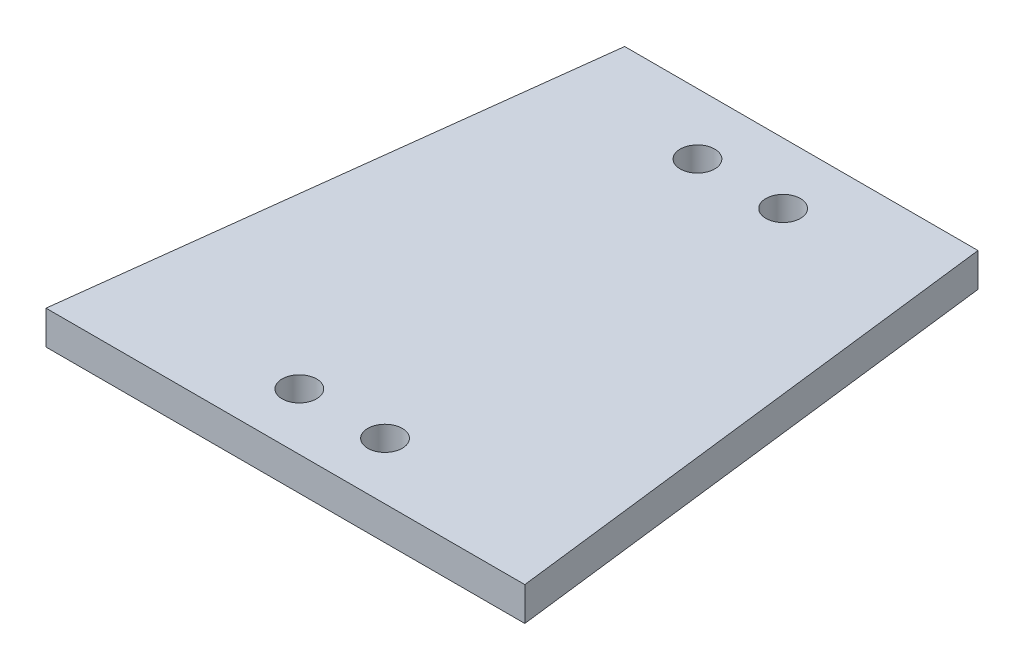
ISO-10303-21;
HEADER;
FILE_DESCRIPTION(('STEP AP214'),'2;1');
FILE_NAME('part.step','',(''),(''),'','','');
FILE_SCHEMA(('AUTOMOTIVE_DESIGN { 1 0 10303 214 1 1 1 1 }'));
ENDSEC;
DATA;
#1=APPLICATION_CONTEXT('core data for automotive mechanical design processes');
#2=APPLICATION_PROTOCOL_DEFINITION('international standard','automotive_design',2000,#1);
#3=PRODUCT_CONTEXT('',#1,'mechanical');
#4=PRODUCT('Part','Part','',(#3));
#5=PRODUCT_RELATED_PRODUCT_CATEGORY('part','',(#4));
#6=PRODUCT_DEFINITION_FORMATION('','',#4);
#7=PRODUCT_DEFINITION_CONTEXT('part definition',#1,'design');
#8=PRODUCT_DEFINITION('design','',#6,#7);
#9=PRODUCT_DEFINITION_SHAPE('','',#8);
#10=(LENGTH_UNIT() NAMED_UNIT(*) SI_UNIT(.MILLI.,.METRE.));
#11=(NAMED_UNIT(*) PLANE_ANGLE_UNIT() SI_UNIT($,.RADIAN.));
#12=(NAMED_UNIT(*) SI_UNIT($,.STERADIAN.) SOLID_ANGLE_UNIT());
#13=UNCERTAINTY_MEASURE_WITH_UNIT(LENGTH_MEASURE(1.E-05),#10,'distance_accuracy_value','');
#14=(GEOMETRIC_REPRESENTATION_CONTEXT(3) GLOBAL_UNCERTAINTY_ASSIGNED_CONTEXT((#13)) GLOBAL_UNIT_ASSIGNED_CONTEXT((#10,
#11,#12)) REPRESENTATION_CONTEXT('',''));
#15=CARTESIAN_POINT('',(0.,0.,0.));
#16=DIRECTION('',(0.,0.,1.));
#17=DIRECTION('',(1.,0.,0.));
#18=AXIS2_PLACEMENT_3D('',#15,#16,#17);
#19=CARTESIAN_POINT('',(-20.9705282743463,-17.9999997913837,-85.0000000134804));
#20=DIRECTION('',(-0.992685958350664,0.,-0.120725258721712));
#21=DIRECTION('',(-0.120725258721712,0.,0.992685958350664));
#22=AXIS2_PLACEMENT_3D('',#19,#20,#21);
#23=PLANE('',#22);
#24=DIRECTION('',(-0.120725258721712,0.,0.992685958350664));
#25=VECTOR('',#24,1.);
#26=CARTESIAN_POINT('',(-20.9705282743463,-13.9999997913837,-85.0000000134804));
#27=LINE('',#26,#25);
#28=CARTESIAN_POINT('',(-20.9705282743463,-13.9999997913837,-85.0000000134804));
#29=VERTEX_POINT('',#28);
#30=CARTESIAN_POINT('',(-28.4184999983606,-13.9999997913837,-23.757663265503));
#31=VERTEX_POINT('',#30);
#32=EDGE_CURVE('E102',#29,#31,#27,.T.);
#33=ORIENTED_EDGE('',*,*,#32,.F.);
#34=DIRECTION('',(0.,1.,0.));
#35=VECTOR('',#34,1.);
#36=CARTESIAN_POINT('',(-20.9705282743463,-17.9999997913837,-85.0000000134804));
#37=LINE('',#36,#35);
#38=CARTESIAN_POINT('',(-20.9705282743463,-17.9999997913837,-85.0000000134804));
#39=VERTEX_POINT('',#38);
#40=EDGE_CURVE('E50',#39,#29,#37,.T.);
#41=ORIENTED_EDGE('',*,*,#40,.F.);
#42=DIRECTION('',(-0.120725258721712,0.,0.992685958350664));
#43=VECTOR('',#42,1.);
#44=CARTESIAN_POINT('',(-20.9705282743463,-17.9999997913837,-85.0000000134804));
#45=LINE('',#44,#43);
#46=CARTESIAN_POINT('',(-28.4184999983606,-17.9999997913837,-23.757663265503));
#47=VERTEX_POINT('',#46);
#48=EDGE_CURVE('E95',#39,#47,#45,.T.);
#49=ORIENTED_EDGE('',*,*,#48,.T.);
#50=DIRECTION('',(0.,1.,0.));
#51=VECTOR('',#50,1.);
#52=CARTESIAN_POINT('',(-28.4184999983606,-17.9999997913837,-23.757663265503));
#53=LINE('',#52,#51);
#54=EDGE_CURVE('E78',#47,#31,#53,.T.);
#55=ORIENTED_EDGE('',*,*,#54,.T.);
#56=EDGE_LOOP('',(#33,#41,#49,#55));
#57=FACE_BOUND('',#56,.T.);
#58=ADVANCED_FACE('F33',(#57),#23,.T.);
#59=CARTESIAN_POINT('',(20.9705282743463,-17.9999997913837,-85.0000000134804));
#60=DIRECTION('',(0.,0.,-1.));
#61=DIRECTION('',(-1.,0.,0.));
#62=AXIS2_PLACEMENT_3D('',#59,#60,#61);
#63=PLANE('',#62);
#64=DIRECTION('',(-1.,0.,0.));
#65=VECTOR('',#64,1.);
#66=CARTESIAN_POINT('',(20.9705282743463,-13.9999997913837,-85.0000000134804));
#67=LINE('',#66,#65);
#68=CARTESIAN_POINT('',(20.9705282743463,-13.9999997913837,-85.0000000134804));
#69=VERTEX_POINT('',#68);
#70=EDGE_CURVE('E97',#69,#29,#67,.T.);
#71=ORIENTED_EDGE('',*,*,#70,.F.);
#72=DIRECTION('',(0.,1.,0.));
#73=VECTOR('',#72,1.);
#74=CARTESIAN_POINT('',(20.9705282743463,-17.9999997913837,-85.0000000134804));
#75=LINE('',#74,#73);
#76=CARTESIAN_POINT('',(20.9705282743463,-17.9999997913837,-85.0000000134804));
#77=VERTEX_POINT('',#76);
#78=EDGE_CURVE('E67',#77,#69,#75,.T.);
#79=ORIENTED_EDGE('',*,*,#78,.F.);
#80=DIRECTION('',(-1.,0.,0.));
#81=VECTOR('',#80,1.);
#82=CARTESIAN_POINT('',(20.9705282743463,-17.9999997913837,-85.0000000134804));
#83=LINE('',#82,#81);
#84=EDGE_CURVE('E92',#77,#39,#83,.T.);
#85=ORIENTED_EDGE('',*,*,#84,.T.);
#86=ORIENTED_EDGE('',*,*,#40,.T.);
#87=EDGE_LOOP('',(#71,#79,#85,#86));
#88=FACE_BOUND('',#87,.T.);
#89=ADVANCED_FACE('F135',(#88),#63,.T.);
#90=CARTESIAN_POINT('',(28.4184999983606,-17.9999997913837,-23.757663265503));
#91=DIRECTION('',(0.992685958350664,0.,-0.120725258721712));
#92=DIRECTION('',(-0.120725258721712,0.,-0.992685958350664));
#93=AXIS2_PLACEMENT_3D('',#90,#91,#92);
#94=PLANE('',#93);
#95=DIRECTION('',(-0.120725258721712,0.,-0.992685958350664));
#96=VECTOR('',#95,1.);
#97=CARTESIAN_POINT('',(28.4184999983606,-13.9999997913837,-23.757663265503));
#98=LINE('',#97,#96);
#99=CARTESIAN_POINT('',(28.4184999983606,-13.9999997913837,-23.757663265503));
#100=VERTEX_POINT('',#99);
#101=EDGE_CURVE('E86',#100,#69,#98,.T.);
#102=ORIENTED_EDGE('',*,*,#101,.F.);
#103=DIRECTION('',(0.,1.,0.));
#104=VECTOR('',#103,1.);
#105=CARTESIAN_POINT('',(28.4184999983606,-17.9999997913837,-23.757663265503));
#106=LINE('',#105,#104);
#107=CARTESIAN_POINT('',(28.4184999983606,-17.9999997913837,-23.757663265503));
#108=VERTEX_POINT('',#107);
#109=EDGE_CURVE('E81',#108,#100,#106,.T.);
#110=ORIENTED_EDGE('',*,*,#109,.F.);
#111=DIRECTION('',(-0.120725258721712,0.,-0.992685958350664));
#112=VECTOR('',#111,1.);
#113=CARTESIAN_POINT('',(28.4184999983606,-17.9999997913837,-23.757663265503));
#114=LINE('',#113,#112);
#115=EDGE_CURVE('E84',#108,#77,#114,.T.);
#116=ORIENTED_EDGE('',*,*,#115,.T.);
#117=ORIENTED_EDGE('',*,*,#78,.T.);
#118=EDGE_LOOP('',(#102,#110,#116,#117));
#119=FACE_BOUND('',#118,.T.);
#120=ADVANCED_FACE('F83',(#119),#94,.T.);
#121=CARTESIAN_POINT('',(-28.4184999983606,-17.9999997913837,-23.757663265503));
#122=DIRECTION('',(0.,0.,1.));
#123=DIRECTION('',(1.,0.,0.));
#124=AXIS2_PLACEMENT_3D('',#121,#122,#123);
#125=PLANE('',#124);
#126=DIRECTION('',(1.,0.,0.));
#127=VECTOR('',#126,1.);
#128=CARTESIAN_POINT('',(-28.4184999983606,-13.9999997913837,-23.757663265503));
#129=LINE('',#128,#127);
#130=EDGE_CURVE('E105',#31,#100,#129,.T.);
#131=ORIENTED_EDGE('',*,*,#130,.F.);
#132=ORIENTED_EDGE('',*,*,#54,.F.);
#133=DIRECTION('',(1.,0.,0.));
#134=VECTOR('',#133,1.);
#135=CARTESIAN_POINT('',(-28.4184999983606,-17.9999997913837,-23.757663265503));
#136=LINE('',#135,#134);
#137=EDGE_CURVE('E91',#47,#108,#136,.T.);
#138=ORIENTED_EDGE('',*,*,#137,.T.);
#139=ORIENTED_EDGE('',*,*,#109,.T.);
#140=EDGE_LOOP('',(#131,#132,#138,#139));
#141=FACE_BOUND('',#140,.T.);
#142=ADVANCED_FACE('F94',(#141),#125,.T.);
#143=CARTESIAN_POINT('',(0.,-17.9999997913837,0.));
#144=DIRECTION('',(0.,1.,0.));
#145=DIRECTION('',(0.,0.,1.));
#146=AXIS2_PLACEMENT_3D('',#143,#144,#145);
#147=PLANE('',#146);
#148=CARTESIAN_POINT('',(-5.08500000000001,-17.9999997913837,-30.495));
#149=DIRECTION('',(0.,1.,0.));
#150=DIRECTION('',(0.,0.,1.));
#151=AXIS2_PLACEMENT_3D('',#148,#149,#150);
#152=CIRCLE('',#151,2.05);
#153=CARTESIAN_POINT('',(-5.08500000000001,-17.9999997913837,-28.445));
#154=VERTEX_POINT('',#153);
#155=EDGE_CURVE('E189',#154,#154,#152,.T.);
#156=ORIENTED_EDGE('',*,*,#155,.T.);
#157=EDGE_LOOP('',(#156));
#158=FACE_BOUND('',#157,.T.);
#159=CARTESIAN_POINT('',(5.08499999999999,-17.9999997913837,-30.495));
#160=DIRECTION('',(0.,1.,0.));
#161=DIRECTION('',(0.,0.,1.));
#162=AXIS2_PLACEMENT_3D('',#159,#160,#161);
#163=CIRCLE('',#162,2.05);
#164=CARTESIAN_POINT('',(5.08499999999999,-17.9999997913837,-28.445));
#165=VERTEX_POINT('',#164);
#166=EDGE_CURVE('E193',#165,#165,#163,.T.);
#167=ORIENTED_EDGE('',*,*,#166,.T.);
#168=EDGE_LOOP('',(#167));
#169=FACE_BOUND('',#168,.T.);
#170=CARTESIAN_POINT('',(5.085,-17.9999997913837,-77.755));
#171=DIRECTION('',(0.,1.,0.));
#172=DIRECTION('',(0.,0.,1.));
#173=AXIS2_PLACEMENT_3D('',#170,#171,#172);
#174=CIRCLE('',#173,2.05);
#175=CARTESIAN_POINT('',(5.085,-17.9999997913837,-75.705));
#176=VERTEX_POINT('',#175);
#177=EDGE_CURVE('E202',#176,#176,#174,.T.);
#178=ORIENTED_EDGE('',*,*,#177,.T.);
#179=EDGE_LOOP('',(#178));
#180=FACE_BOUND('',#179,.T.);
#181=CARTESIAN_POINT('',(-5.085,-17.9999997913837,-77.755));
#182=DIRECTION('',(0.,1.,0.));
#183=DIRECTION('',(0.,0.,1.));
#184=AXIS2_PLACEMENT_3D('',#181,#182,#183);
#185=CIRCLE('',#184,2.05);
#186=CARTESIAN_POINT('',(-5.085,-17.9999997913837,-75.705));
#187=VERTEX_POINT('',#186);
#188=EDGE_CURVE('E208',#187,#187,#185,.T.);
#189=ORIENTED_EDGE('',*,*,#188,.T.);
#190=EDGE_LOOP('',(#189));
#191=FACE_BOUND('',#190,.T.);
#192=CARTESIAN_POINT('',(0.,-17.9999997913837,-64.6650000134804));
#193=DIRECTION('',(0.,1.,0.));
#194=DIRECTION('',(-1.,0.,0.));
#195=AXIS2_PLACEMENT_3D('',#192,#193,#194);
#196=CIRCLE('',#195,8.);
#197=CARTESIAN_POINT('',(-7.99999999999999,-17.9999997913837,-64.6650000134804));
#198=VERTEX_POINT('',#197);
#199=EDGE_CURVE('E106',#198,#198,#196,.T.);
#200=ORIENTED_EDGE('',*,*,#199,.T.);
#201=EDGE_LOOP('',(#200));
#202=FACE_BOUND('',#201,.T.);
#203=ORIENTED_EDGE('',*,*,#48,.F.);
#204=ORIENTED_EDGE('',*,*,#84,.F.);
#205=ORIENTED_EDGE('',*,*,#115,.F.);
#206=ORIENTED_EDGE('',*,*,#137,.F.);
#207=EDGE_LOOP('',(#203,#204,#205,#206));
#208=FACE_BOUND('',#207,.T.);
#209=ADVANCED_FACE('F90',(#158,#169,#180,#191,#202,#208),#147,.F.);
#210=CARTESIAN_POINT('',(0.,-13.9999997913837,0.));
#211=DIRECTION('',(0.,1.,0.));
#212=DIRECTION('',(0.,0.,1.));
#213=AXIS2_PLACEMENT_3D('',#210,#211,#212);
#214=PLANE('',#213);
#215=CARTESIAN_POINT('',(-5.08500000000001,-13.9999997913837,-30.495));
#216=DIRECTION('',(0.,1.,0.));
#217=DIRECTION('',(0.,0.,1.));
#218=AXIS2_PLACEMENT_3D('',#215,#216,#217);
#219=CIRCLE('',#218,2.04999999999999);
#220=CARTESIAN_POINT('',(-5.08500000000001,-13.9999997913837,-28.445));
#221=VERTEX_POINT('',#220);
#222=EDGE_CURVE('E186',#221,#221,#219,.T.);
#223=ORIENTED_EDGE('',*,*,#222,.F.);
#224=EDGE_LOOP('',(#223));
#225=FACE_BOUND('',#224,.T.);
#226=CARTESIAN_POINT('',(5.08499999999999,-13.9999997913837,-30.495));
#227=DIRECTION('',(0.,1.,0.));
#228=DIRECTION('',(0.,0.,1.));
#229=AXIS2_PLACEMENT_3D('',#226,#227,#228);
#230=CIRCLE('',#229,2.04999999999999);
#231=CARTESIAN_POINT('',(5.08499999999999,-13.9999997913837,-28.445));
#232=VERTEX_POINT('',#231);
#233=EDGE_CURVE('E190',#232,#232,#230,.T.);
#234=ORIENTED_EDGE('',*,*,#233,.F.);
#235=EDGE_LOOP('',(#234));
#236=FACE_BOUND('',#235,.T.);
#237=CARTESIAN_POINT('',(5.085,-13.9999997913837,-77.755));
#238=DIRECTION('',(0.,1.,0.));
#239=DIRECTION('',(0.,0.,1.));
#240=AXIS2_PLACEMENT_3D('',#237,#238,#239);
#241=CIRCLE('',#240,2.04999999999999);
#242=CARTESIAN_POINT('',(5.085,-13.9999997913837,-75.705));
#243=VERTEX_POINT('',#242);
#244=EDGE_CURVE('E199',#243,#243,#241,.T.);
#245=ORIENTED_EDGE('',*,*,#244,.F.);
#246=EDGE_LOOP('',(#245));
#247=FACE_BOUND('',#246,.T.);
#248=CARTESIAN_POINT('',(-5.085,-13.9999997913837,-77.755));
#249=DIRECTION('',(0.,1.,0.));
#250=DIRECTION('',(0.,0.,1.));
#251=AXIS2_PLACEMENT_3D('',#248,#249,#250);
#252=CIRCLE('',#251,2.04999999999999);
#253=CARTESIAN_POINT('',(-5.085,-13.9999997913837,-75.705));
#254=VERTEX_POINT('',#253);
#255=EDGE_CURVE('E205',#254,#254,#252,.T.);
#256=ORIENTED_EDGE('',*,*,#255,.F.);
#257=EDGE_LOOP('',(#256));
#258=FACE_BOUND('',#257,.T.);
#259=ORIENTED_EDGE('',*,*,#32,.T.);
#260=ORIENTED_EDGE('',*,*,#130,.T.);
#261=ORIENTED_EDGE('',*,*,#101,.T.);
#262=ORIENTED_EDGE('',*,*,#70,.T.);
#263=EDGE_LOOP('',(#259,#260,#261,#262));
#264=FACE_BOUND('',#263,.T.);
#265=ADVANCED_FACE('F146',(#225,#236,#247,#258,#264),#214,.T.);
#266=CARTESIAN_POINT('',(0.,-29.9999997913837,-64.6650000134804));
#267=DIRECTION('',(0.,1.,0.));
#268=DIRECTION('',(-1.,0.,0.));
#269=AXIS2_PLACEMENT_3D('',#266,#267,#268);
#270=CYLINDRICAL_SURFACE('',#269,3.85);
#271=CARTESIAN_POINT('',(0.,-28.9999997913837,-64.6650000134804));
#272=DIRECTION('',(0.,-1.,0.));
#273=DIRECTION('',(1.,0.,0.));
#274=AXIS2_PLACEMENT_3D('',#271,#272,#273);
#275=CIRCLE('',#274,3.85);
#276=CARTESIAN_POINT('',(3.85,-28.9999997913837,-64.6650000134804));
#277=VERTEX_POINT('',#276);
#278=EDGE_CURVE('E42',#277,#277,#275,.F.);
#279=ORIENTED_EDGE('',*,*,#278,.T.);
#280=EDGE_LOOP('',(#279));
#281=FACE_BOUND('',#280,.T.);
#282=CARTESIAN_POINT('',(0.,-23.9999997913837,-64.6650000134804));
#283=DIRECTION('',(0.,1.,0.));
#284=DIRECTION('',(-1.,0.,0.));
#285=AXIS2_PLACEMENT_3D('',#282,#283,#284);
#286=CIRCLE('',#285,3.85);
#287=CARTESIAN_POINT('',(-3.85,-23.9999997913837,-64.6650000134804));
#288=VERTEX_POINT('',#287);
#289=EDGE_CURVE('E211',#288,#288,#286,.T.);
#290=ORIENTED_EDGE('',*,*,#289,.F.);
#291=EDGE_LOOP('',(#290));
#292=FACE_BOUND('',#291,.T.);
#293=ADVANCED_FACE('F122',(#281,#292),#270,.T.);
#294=CARTESIAN_POINT('',(3.85,-29.9999997913837,-64.6650000134804));
#295=DIRECTION('',(0.,-1.,0.));
#296=DIRECTION('',(1.,0.,0.));
#297=AXIS2_PLACEMENT_3D('',#294,#295,#296);
#298=PLANE('',#297);
#299=CARTESIAN_POINT('',(0.,-29.9999997913837,-64.6650000134804));
#300=DIRECTION('',(0.,-1.,0.));
#301=DIRECTION('',(1.,0.,0.));
#302=AXIS2_PLACEMENT_3D('',#299,#300,#301);
#303=CIRCLE('',#302,2.84999999999999);
#304=CARTESIAN_POINT('',(2.84999999999999,-29.9999997913837,-64.6650000134804));
#305=VERTEX_POINT('',#304);
#306=EDGE_CURVE('E11',#305,#305,#303,.T.);
#307=ORIENTED_EDGE('',*,*,#306,.T.);
#308=EDGE_LOOP('',(#307));
#309=FACE_BOUND('',#308,.T.);
#310=ADVANCED_FACE('F155',(#309),#298,.T.);
#311=CARTESIAN_POINT('',(0.,-29.9999997913837,-64.6650000134804));
#312=DIRECTION('',(0.,1.,0.));
#313=DIRECTION('',(-1.,0.,0.));
#314=AXIS2_PLACEMENT_3D('',#311,#312,#313);
#315=CYLINDRICAL_SURFACE('',#314,8.);
#316=CARTESIAN_POINT('',(0.,-22.9999997913837,-64.6650000134804));
#317=DIRECTION('',(0.,-1.,0.));
#318=DIRECTION('',(1.,0.,0.));
#319=AXIS2_PLACEMENT_3D('',#316,#317,#318);
#320=CIRCLE('',#319,8.);
#321=CARTESIAN_POINT('',(8.,-22.9999997913837,-64.6650000134804));
#322=VERTEX_POINT('',#321);
#323=EDGE_CURVE('E112',#322,#322,#320,.F.);
#324=ORIENTED_EDGE('',*,*,#323,.T.);
#325=EDGE_LOOP('',(#324));
#326=FACE_BOUND('',#325,.T.);
#327=ORIENTED_EDGE('',*,*,#199,.F.);
#328=EDGE_LOOP('',(#327));
#329=FACE_BOUND('',#328,.T.);
#330=ADVANCED_FACE('F158',(#326,#329),#315,.T.);
#331=CARTESIAN_POINT('',(8.,-23.9999997913837,-64.6650000134804));
#332=DIRECTION('',(0.,-1.,0.));
#333=DIRECTION('',(1.,0.,0.));
#334=AXIS2_PLACEMENT_3D('',#331,#332,#333);
#335=PLANE('',#334);
#336=CARTESIAN_POINT('',(0.,-23.9999997913837,-64.6650000134804));
#337=DIRECTION('',(0.,-1.,0.));
#338=DIRECTION('',(1.,0.,0.));
#339=AXIS2_PLACEMENT_3D('',#336,#337,#338);
#340=CIRCLE('',#339,6.99999999999999);
#341=CARTESIAN_POINT('',(7.,-23.9999997913837,-64.6650000134804));
#342=VERTEX_POINT('',#341);
#343=EDGE_CURVE('E117',#342,#342,#340,.T.);
#344=ORIENTED_EDGE('',*,*,#343,.T.);
#345=EDGE_LOOP('',(#344));
#346=FACE_BOUND('',#345,.T.);
#347=ORIENTED_EDGE('',*,*,#289,.T.);
#348=EDGE_LOOP('',(#347));
#349=FACE_BOUND('',#348,.T.);
#350=ADVANCED_FACE('F162',(#346,#349),#335,.T.);
#351=CARTESIAN_POINT('',(-5.085,-13.9999997913837,-77.755));
#352=DIRECTION('',(0.,1.,0.));
#353=DIRECTION('',(0.,0.,1.));
#354=AXIS2_PLACEMENT_3D('',#351,#352,#353);
#355=CYLINDRICAL_SURFACE('',#354,2.05);
#356=ORIENTED_EDGE('',*,*,#255,.T.);
#357=EDGE_LOOP('',(#356));
#358=FACE_BOUND('',#357,.T.);
#359=ORIENTED_EDGE('',*,*,#188,.F.);
#360=EDGE_LOOP('',(#359));
#361=FACE_BOUND('',#360,.T.);
#362=ADVANCED_FACE('F166',(#358,#361),#355,.F.);
#363=CARTESIAN_POINT('',(5.085,-13.9999997913837,-77.755));
#364=DIRECTION('',(0.,1.,0.));
#365=DIRECTION('',(0.,0.,1.));
#366=AXIS2_PLACEMENT_3D('',#363,#364,#365);
#367=CYLINDRICAL_SURFACE('',#366,2.05);
#368=ORIENTED_EDGE('',*,*,#244,.T.);
#369=EDGE_LOOP('',(#368));
#370=FACE_BOUND('',#369,.T.);
#371=ORIENTED_EDGE('',*,*,#177,.F.);
#372=EDGE_LOOP('',(#371));
#373=FACE_BOUND('',#372,.T.);
#374=ADVANCED_FACE('F170',(#370,#373),#367,.F.);
#375=CARTESIAN_POINT('',(5.08499999999999,-13.9999997913837,-30.495));
#376=DIRECTION('',(0.,1.,0.));
#377=DIRECTION('',(0.,0.,1.));
#378=AXIS2_PLACEMENT_3D('',#375,#376,#377);
#379=CYLINDRICAL_SURFACE('',#378,2.05);
#380=ORIENTED_EDGE('',*,*,#233,.T.);
#381=EDGE_LOOP('',(#380));
#382=FACE_BOUND('',#381,.T.);
#383=ORIENTED_EDGE('',*,*,#166,.F.);
#384=EDGE_LOOP('',(#383));
#385=FACE_BOUND('',#384,.T.);
#386=ADVANCED_FACE('F174',(#382,#385),#379,.F.);
#387=CARTESIAN_POINT('',(-5.08500000000001,-13.9999997913837,-30.495));
#388=DIRECTION('',(0.,1.,0.));
#389=DIRECTION('',(0.,0.,1.));
#390=AXIS2_PLACEMENT_3D('',#387,#388,#389);
#391=CYLINDRICAL_SURFACE('',#390,2.05);
#392=ORIENTED_EDGE('',*,*,#222,.T.);
#393=EDGE_LOOP('',(#392));
#394=FACE_BOUND('',#393,.T.);
#395=ORIENTED_EDGE('',*,*,#155,.F.);
#396=EDGE_LOOP('',(#395));
#397=FACE_BOUND('',#396,.T.);
#398=ADVANCED_FACE('F131',(#394,#397),#391,.F.);
#399=CARTESIAN_POINT('',(0.,-22.9999997913837,-64.6650000134804));
#400=DIRECTION('',(0.,1.,0.));
#401=DIRECTION('',(-1.,0.,0.));
#402=AXIS2_PLACEMENT_3D('',#399,#400,#401);
#403=CONICAL_SURFACE('',#402,8.,0.785398163397448);
#404=ORIENTED_EDGE('',*,*,#343,.F.);
#405=EDGE_LOOP('',(#404));
#406=FACE_BOUND('',#405,.T.);
#407=ORIENTED_EDGE('',*,*,#323,.F.);
#408=EDGE_LOOP('',(#407));
#409=FACE_BOUND('',#408,.T.);
#410=ADVANCED_FACE('F126',(#406,#409),#403,.T.);
#411=CARTESIAN_POINT('',(0.,-28.9999997913837,-64.6650000134804));
#412=DIRECTION('',(0.,1.,0.));
#413=DIRECTION('',(-1.,0.,0.));
#414=AXIS2_PLACEMENT_3D('',#411,#412,#413);
#415=CONICAL_SURFACE('',#414,3.85,0.785398163397452);
#416=ORIENTED_EDGE('',*,*,#306,.F.);
#417=EDGE_LOOP('',(#416));
#418=FACE_BOUND('',#417,.T.);
#419=ORIENTED_EDGE('',*,*,#278,.F.);
#420=EDGE_LOOP('',(#419));
#421=FACE_BOUND('',#420,.T.);
#422=ADVANCED_FACE('F35',(#418,#421),#415,.T.);
#423=CLOSED_SHELL('',(#58,#89,#120,#142,#209,#265,#293,#310,#330,#350,#362,#374,#386,#398,#410,#422));
#424=MANIFOLD_SOLID_BREP('B2',#423);
#425=ADVANCED_BREP_SHAPE_REPRESENTATION('',(#18,#424),#14);
#426=SHAPE_DEFINITION_REPRESENTATION(#9,#425);
ENDSEC;
END-ISO-10303-21;
